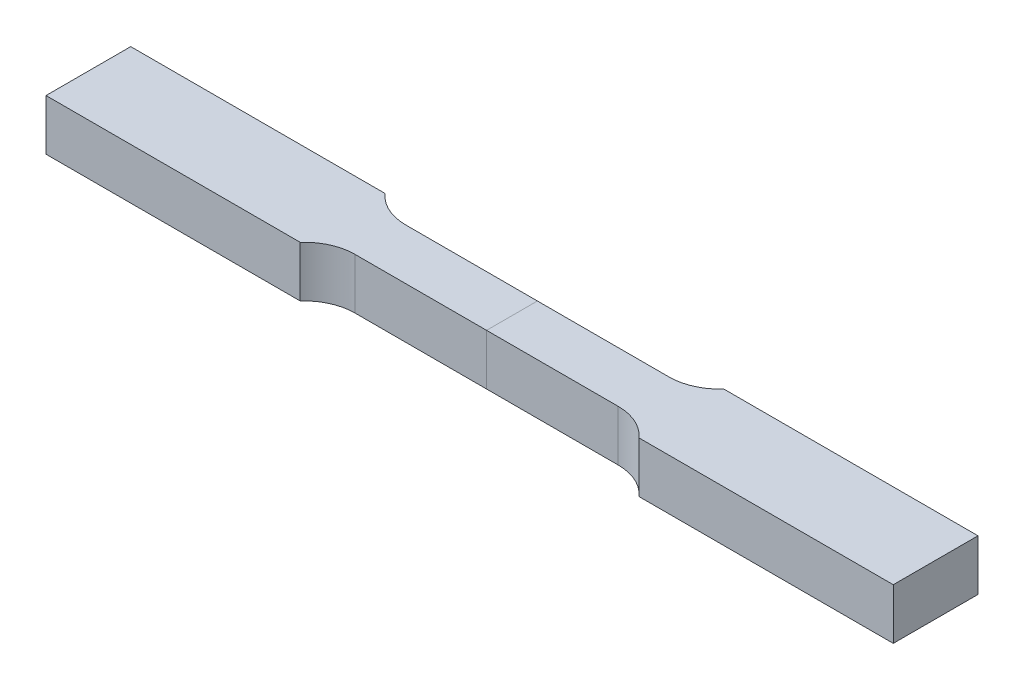
ISO-10303-21;
HEADER;
FILE_DESCRIPTION(('STEP AP214'),'2;1');
FILE_NAME('part.step','',(''),(''),'','','');
FILE_SCHEMA(('AUTOMOTIVE_DESIGN { 1 0 10303 214 1 1 1 1 }'));
ENDSEC;
DATA;
#1=APPLICATION_CONTEXT('core data for automotive mechanical design processes');
#2=APPLICATION_PROTOCOL_DEFINITION('international standard','automotive_design',2000,#1);
#3=PRODUCT_CONTEXT('',#1,'mechanical');
#4=PRODUCT('Part','Part','',(#3));
#5=PRODUCT_RELATED_PRODUCT_CATEGORY('part','',(#4));
#6=PRODUCT_DEFINITION_FORMATION('','',#4);
#7=PRODUCT_DEFINITION_CONTEXT('part definition',#1,'design');
#8=PRODUCT_DEFINITION('design','',#6,#7);
#9=PRODUCT_DEFINITION_SHAPE('','',#8);
#10=(LENGTH_UNIT() NAMED_UNIT(*) SI_UNIT(.MILLI.,.METRE.));
#11=(NAMED_UNIT(*) PLANE_ANGLE_UNIT() SI_UNIT($,.RADIAN.));
#12=(NAMED_UNIT(*) SI_UNIT($,.STERADIAN.) SOLID_ANGLE_UNIT());
#13=UNCERTAINTY_MEASURE_WITH_UNIT(LENGTH_MEASURE(1.E-05),#10,'distance_accuracy_value','');
#14=(GEOMETRIC_REPRESENTATION_CONTEXT(3) GLOBAL_UNCERTAINTY_ASSIGNED_CONTEXT((#13)) GLOBAL_UNIT_ASSIGNED_CONTEXT((#10,
#11,#12)) REPRESENTATION_CONTEXT('',''));
#15=CARTESIAN_POINT('',(0.,0.,0.));
#16=DIRECTION('',(0.,0.,1.));
#17=DIRECTION('',(1.,0.,0.));
#18=AXIS2_PLACEMENT_3D('',#15,#16,#17);
#19=CARTESIAN_POINT('',(0.,6.,-3.));
#20=DIRECTION('',(0.,0.,1.));
#21=DIRECTION('',(-1.,0.,0.));
#22=AXIS2_PLACEMENT_3D('',#19,#20,#21);
#23=PLANE('',#22);
#24=DIRECTION('',(1.,0.,0.));
#25=VECTOR('',#24,1.);
#26=CARTESIAN_POINT('',(0.,0.,-3.));
#27=LINE('',#26,#25);
#28=CARTESIAN_POINT('',(0.,0.,-3.));
#29=VERTEX_POINT('',#28);
#30=CARTESIAN_POINT('',(15.5278640450004,0.,-3.));
#31=VERTEX_POINT('',#30);
#32=EDGE_CURVE('E144',#29,#31,#27,.T.);
#33=ORIENTED_EDGE('',*,*,#32,.F.);
#34=DIRECTION('',(0.,-1.,0.));
#35=VECTOR('',#34,1.);
#36=CARTESIAN_POINT('',(0.,6.,-3.));
#37=LINE('',#36,#35);
#38=CARTESIAN_POINT('',(0.,6.,-3.));
#39=VERTEX_POINT('',#38);
#40=EDGE_CURVE('E143',#39,#29,#37,.T.);
#41=ORIENTED_EDGE('',*,*,#40,.F.);
#42=DIRECTION('',(1.,0.,0.));
#43=VECTOR('',#42,1.);
#44=CARTESIAN_POINT('',(0.,6.,-3.));
#45=LINE('',#44,#43);
#46=CARTESIAN_POINT('',(15.5278640450004,6.,-3.));
#47=VERTEX_POINT('',#46);
#48=EDGE_CURVE('E162',#39,#47,#45,.T.);
#49=ORIENTED_EDGE('',*,*,#48,.T.);
#50=DIRECTION('',(0.,-1.,0.));
#51=VECTOR('',#50,1.);
#52=CARTESIAN_POINT('',(15.5278640450004,6.,-3.));
#53=LINE('',#52,#51);
#54=EDGE_CURVE('E12',#47,#31,#53,.T.);
#55=ORIENTED_EDGE('',*,*,#54,.T.);
#56=EDGE_LOOP('',(#33,#41,#49,#55));
#57=FACE_BOUND('',#56,.T.);
#58=ADVANCED_FACE('F48',(#57),#23,.F.);
#59=CARTESIAN_POINT('',(15.5278640450004,6.,-8.99999999999999));
#60=DIRECTION('',(0.,-1.,0.));
#61=DIRECTION('',(0.,0.,-1.));
#62=AXIS2_PLACEMENT_3D('',#59,#60,#61);
#63=CYLINDRICAL_SURFACE('',#62,6.);
#64=CARTESIAN_POINT('',(15.5278640450004,0.,-8.99999999999999));
#65=DIRECTION('',(0.,1.,0.));
#66=DIRECTION('',(0.,0.,-1.));
#67=AXIS2_PLACEMENT_3D('',#64,#65,#66);
#68=CIRCLE('',#67,6.);
#69=CARTESIAN_POINT('',(20.,0.,-5.));
#70=VERTEX_POINT('',#69);
#71=EDGE_CURVE('E146',#31,#70,#68,.T.);
#72=ORIENTED_EDGE('',*,*,#71,.F.);
#73=ORIENTED_EDGE('',*,*,#54,.F.);
#74=CARTESIAN_POINT('',(15.5278640450004,6.,-8.99999999999999));
#75=DIRECTION('',(0.,1.,0.));
#76=DIRECTION('',(0.,0.,-1.));
#77=AXIS2_PLACEMENT_3D('',#74,#75,#76);
#78=CIRCLE('',#77,6.);
#79=CARTESIAN_POINT('',(20.,6.,-5.));
#80=VERTEX_POINT('',#79);
#81=EDGE_CURVE('E102',#47,#80,#78,.T.);
#82=ORIENTED_EDGE('',*,*,#81,.T.);
#83=DIRECTION('',(0.,-1.,0.));
#84=VECTOR('',#83,1.);
#85=CARTESIAN_POINT('',(20.,6.,-5.));
#86=LINE('',#85,#84);
#87=EDGE_CURVE('E56',#80,#70,#86,.T.);
#88=ORIENTED_EDGE('',*,*,#87,.T.);
#89=EDGE_LOOP('',(#72,#73,#82,#88));
#90=FACE_BOUND('',#89,.T.);
#91=ADVANCED_FACE('F174',(#90),#63,.F.);
#92=CARTESIAN_POINT('',(20.,6.,-5.));
#93=DIRECTION('',(0.,0.,1.));
#94=DIRECTION('',(-1.,0.,0.));
#95=AXIS2_PLACEMENT_3D('',#92,#93,#94);
#96=PLANE('',#95);
#97=DIRECTION('',(1.,0.,0.));
#98=VECTOR('',#97,1.);
#99=CARTESIAN_POINT('',(20.,0.,-5.));
#100=LINE('',#99,#98);
#101=CARTESIAN_POINT('',(50.,0.,-4.99999999999999));
#102=VERTEX_POINT('',#101);
#103=EDGE_CURVE('E149',#70,#102,#100,.T.);
#104=ORIENTED_EDGE('',*,*,#103,.F.);
#105=ORIENTED_EDGE('',*,*,#87,.F.);
#106=DIRECTION('',(1.,0.,0.));
#107=VECTOR('',#106,1.);
#108=CARTESIAN_POINT('',(20.,6.,-5.));
#109=LINE('',#108,#107);
#110=CARTESIAN_POINT('',(50.,6.,-4.99999999999999));
#111=VERTEX_POINT('',#110);
#112=EDGE_CURVE('E183',#80,#111,#109,.T.);
#113=ORIENTED_EDGE('',*,*,#112,.T.);
#114=DIRECTION('',(0.,-1.,0.));
#115=VECTOR('',#114,1.);
#116=CARTESIAN_POINT('',(50.,6.,-4.99999999999999));
#117=LINE('',#116,#115);
#118=EDGE_CURVE('E169',#111,#102,#117,.T.);
#119=ORIENTED_EDGE('',*,*,#118,.T.);
#120=EDGE_LOOP('',(#104,#105,#113,#119));
#121=FACE_BOUND('',#120,.T.);
#122=ADVANCED_FACE('F193',(#121),#96,.F.);
#123=CARTESIAN_POINT('',(50.,6.,-4.99999999999999));
#124=DIRECTION('',(-1.,0.,0.));
#125=DIRECTION('',(0.,0.,-1.));
#126=AXIS2_PLACEMENT_3D('',#123,#124,#125);
#127=PLANE('',#126);
#128=DIRECTION('',(0.,0.,1.));
#129=VECTOR('',#128,1.);
#130=CARTESIAN_POINT('',(50.,0.,-4.99999999999999));
#131=LINE('',#130,#129);
#132=CARTESIAN_POINT('',(50.,0.,5.00000000000001));
#133=VERTEX_POINT('',#132);
#134=EDGE_CURVE('E152',#102,#133,#131,.T.);
#135=ORIENTED_EDGE('',*,*,#134,.F.);
#136=ORIENTED_EDGE('',*,*,#118,.F.);
#137=DIRECTION('',(0.,0.,1.));
#138=VECTOR('',#137,1.);
#139=CARTESIAN_POINT('',(50.,6.,-4.99999999999999));
#140=LINE('',#139,#138);
#141=CARTESIAN_POINT('',(50.,6.,5.00000000000001));
#142=VERTEX_POINT('',#141);
#143=EDGE_CURVE('E138',#111,#142,#140,.T.);
#144=ORIENTED_EDGE('',*,*,#143,.T.);
#145=DIRECTION('',(0.,-1.,0.));
#146=VECTOR('',#145,1.);
#147=CARTESIAN_POINT('',(50.,6.,5.00000000000001));
#148=LINE('',#147,#146);
#149=EDGE_CURVE('E166',#142,#133,#148,.T.);
#150=ORIENTED_EDGE('',*,*,#149,.T.);
#151=EDGE_LOOP('',(#135,#136,#144,#150));
#152=FACE_BOUND('',#151,.T.);
#153=ADVANCED_FACE('F189',(#152),#127,.F.);
#154=CARTESIAN_POINT('',(50.,6.,5.00000000000001));
#155=DIRECTION('',(0.,0.,-1.));
#156=DIRECTION('',(1.,0.,0.));
#157=AXIS2_PLACEMENT_3D('',#154,#155,#156);
#158=PLANE('',#157);
#159=DIRECTION('',(-1.,0.,0.));
#160=VECTOR('',#159,1.);
#161=CARTESIAN_POINT('',(50.,0.,5.00000000000001));
#162=LINE('',#161,#160);
#163=CARTESIAN_POINT('',(20.,0.,5.00000000000001));
#164=VERTEX_POINT('',#163);
#165=EDGE_CURVE('E155',#133,#164,#162,.T.);
#166=ORIENTED_EDGE('',*,*,#165,.F.);
#167=ORIENTED_EDGE('',*,*,#149,.F.);
#168=DIRECTION('',(-1.,0.,0.));
#169=VECTOR('',#168,1.);
#170=CARTESIAN_POINT('',(50.,6.,5.00000000000001));
#171=LINE('',#170,#169);
#172=CARTESIAN_POINT('',(20.,6.,5.00000000000001));
#173=VERTEX_POINT('',#172);
#174=EDGE_CURVE('E136',#142,#173,#171,.T.);
#175=ORIENTED_EDGE('',*,*,#174,.T.);
#176=DIRECTION('',(0.,-1.,0.));
#177=VECTOR('',#176,1.);
#178=CARTESIAN_POINT('',(20.,6.,5.00000000000001));
#179=LINE('',#178,#177);
#180=EDGE_CURVE('E130',#173,#164,#179,.T.);
#181=ORIENTED_EDGE('',*,*,#180,.T.);
#182=EDGE_LOOP('',(#166,#167,#175,#181));
#183=FACE_BOUND('',#182,.T.);
#184=ADVANCED_FACE('F192',(#183),#158,.F.);
#185=CARTESIAN_POINT('',(15.5278640450004,6.,9.));
#186=DIRECTION('',(0.,-1.,0.));
#187=DIRECTION('',(0.,0.,-1.));
#188=AXIS2_PLACEMENT_3D('',#185,#186,#187);
#189=CYLINDRICAL_SURFACE('',#188,6.);
#190=CARTESIAN_POINT('',(15.5278640450004,0.,9.));
#191=DIRECTION('',(0.,1.,0.));
#192=DIRECTION('',(0.,0.,-1.));
#193=AXIS2_PLACEMENT_3D('',#190,#191,#192);
#194=CIRCLE('',#193,6.);
#195=CARTESIAN_POINT('',(15.5278640450004,0.,3.));
#196=VERTEX_POINT('',#195);
#197=EDGE_CURVE('E158',#164,#196,#194,.T.);
#198=ORIENTED_EDGE('',*,*,#197,.F.);
#199=ORIENTED_EDGE('',*,*,#180,.F.);
#200=CARTESIAN_POINT('',(15.5278640450004,6.,9.));
#201=DIRECTION('',(0.,1.,0.));
#202=DIRECTION('',(0.,0.,-1.));
#203=AXIS2_PLACEMENT_3D('',#200,#201,#202);
#204=CIRCLE('',#203,6.);
#205=CARTESIAN_POINT('',(15.5278640450004,6.,3.));
#206=VERTEX_POINT('',#205);
#207=EDGE_CURVE('E120',#173,#206,#204,.T.);
#208=ORIENTED_EDGE('',*,*,#207,.T.);
#209=DIRECTION('',(0.,-1.,0.));
#210=VECTOR('',#209,1.);
#211=CARTESIAN_POINT('',(15.5278640450004,6.,3.));
#212=LINE('',#211,#210);
#213=EDGE_CURVE('E125',#206,#196,#212,.T.);
#214=ORIENTED_EDGE('',*,*,#213,.T.);
#215=EDGE_LOOP('',(#198,#199,#208,#214));
#216=FACE_BOUND('',#215,.T.);
#217=ADVANCED_FACE('F133',(#216),#189,.F.);
#218=CARTESIAN_POINT('',(15.5278640450004,6.,3.));
#219=DIRECTION('',(0.,0.,-1.));
#220=DIRECTION('',(1.,0.,0.));
#221=AXIS2_PLACEMENT_3D('',#218,#219,#220);
#222=PLANE('',#221);
#223=DIRECTION('',(-1.,0.,0.));
#224=VECTOR('',#223,1.);
#225=CARTESIAN_POINT('',(15.5278640450004,0.,3.));
#226=LINE('',#225,#224);
#227=CARTESIAN_POINT('',(0.,0.,3.));
#228=VERTEX_POINT('',#227);
#229=EDGE_CURVE('E127',#196,#228,#226,.T.);
#230=ORIENTED_EDGE('',*,*,#229,.F.);
#231=ORIENTED_EDGE('',*,*,#213,.F.);
#232=DIRECTION('',(-1.,0.,0.));
#233=VECTOR('',#232,1.);
#234=CARTESIAN_POINT('',(15.5278640450004,6.,3.));
#235=LINE('',#234,#233);
#236=CARTESIAN_POINT('',(0.,6.,3.));
#237=VERTEX_POINT('',#236);
#238=EDGE_CURVE('E116',#206,#237,#235,.T.);
#239=ORIENTED_EDGE('',*,*,#238,.T.);
#240=DIRECTION('',(0.,-1.,0.));
#241=VECTOR('',#240,1.);
#242=CARTESIAN_POINT('',(0.,6.,3.));
#243=LINE('',#242,#241);
#244=EDGE_CURVE('E131',#237,#228,#243,.T.);
#245=ORIENTED_EDGE('',*,*,#244,.T.);
#246=EDGE_LOOP('',(#230,#231,#239,#245));
#247=FACE_BOUND('',#246,.T.);
#248=ADVANCED_FACE('F126',(#247),#222,.F.);
#249=CARTESIAN_POINT('',(0.,6.,3.));
#250=DIRECTION('',(1.,0.,0.));
#251=DIRECTION('',(0.,0.,1.));
#252=AXIS2_PLACEMENT_3D('',#249,#250,#251);
#253=PLANE('',#252);
#254=DIRECTION('',(0.,0.,-1.));
#255=VECTOR('',#254,1.);
#256=CARTESIAN_POINT('',(0.,0.,3.));
#257=LINE('',#256,#255);
#258=EDGE_CURVE('E90',#228,#29,#257,.T.);
#259=ORIENTED_EDGE('',*,*,#258,.F.);
#260=ORIENTED_EDGE('',*,*,#244,.F.);
#261=DIRECTION('',(0.,0.,-1.));
#262=VECTOR('',#261,1.);
#263=CARTESIAN_POINT('',(0.,6.,3.));
#264=LINE('',#263,#262);
#265=EDGE_CURVE('E64',#237,#39,#264,.T.);
#266=ORIENTED_EDGE('',*,*,#265,.T.);
#267=ORIENTED_EDGE('',*,*,#40,.T.);
#268=EDGE_LOOP('',(#259,#260,#266,#267));
#269=FACE_BOUND('',#268,.T.);
#270=ADVANCED_FACE('F243',(#269),#253,.F.);
#271=CARTESIAN_POINT('',(15.5278640450004,6.,-8.99999999999999));
#272=DIRECTION('',(0.,-1.,0.));
#273=DIRECTION('',(0.,0.,-1.));
#274=AXIS2_PLACEMENT_3D('',#271,#272,#273);
#275=PLANE('',#274);
#276=ORIENTED_EDGE('',*,*,#48,.F.);
#277=ORIENTED_EDGE('',*,*,#265,.F.);
#278=ORIENTED_EDGE('',*,*,#238,.F.);
#279=ORIENTED_EDGE('',*,*,#207,.F.);
#280=ORIENTED_EDGE('',*,*,#174,.F.);
#281=ORIENTED_EDGE('',*,*,#143,.F.);
#282=ORIENTED_EDGE('',*,*,#112,.F.);
#283=ORIENTED_EDGE('',*,*,#81,.F.);
#284=EDGE_LOOP('',(#276,#277,#278,#279,#280,#281,#282,#283));
#285=FACE_BOUND('',#284,.T.);
#286=ADVANCED_FACE('F118',(#285),#275,.F.);
#287=CARTESIAN_POINT('',(15.5278640450004,0.,-8.99999999999999));
#288=DIRECTION('',(0.,-1.,0.));
#289=DIRECTION('',(0.,0.,-1.));
#290=AXIS2_PLACEMENT_3D('',#287,#288,#289);
#291=PLANE('',#290);
#292=ORIENTED_EDGE('',*,*,#32,.T.);
#293=ORIENTED_EDGE('',*,*,#71,.T.);
#294=ORIENTED_EDGE('',*,*,#103,.T.);
#295=ORIENTED_EDGE('',*,*,#134,.T.);
#296=ORIENTED_EDGE('',*,*,#165,.T.);
#297=ORIENTED_EDGE('',*,*,#197,.T.);
#298=ORIENTED_EDGE('',*,*,#229,.T.);
#299=ORIENTED_EDGE('',*,*,#258,.T.);
#300=EDGE_LOOP('',(#292,#293,#294,#295,#296,#297,#298,#299));
#301=FACE_BOUND('',#300,.T.);
#302=ADVANCED_FACE('F177',(#301),#291,.T.);
#303=CLOSED_SHELL('',(#58,#91,#122,#153,#184,#217,#248,#270,#286,#302));
#304=MANIFOLD_SOLID_BREP('B2',#303);
#305=CARTESIAN_POINT('',(0.,6.,-3.));
#306=DIRECTION('',(0.,0.,1.));
#307=DIRECTION('',(1.,0.,0.));
#308=AXIS2_PLACEMENT_3D('',#305,#306,#307);
#309=PLANE('',#308);
#310=DIRECTION('',(-1.,0.,0.));
#311=VECTOR('',#310,1.);
#312=CARTESIAN_POINT('',(0.,0.,-3.));
#313=LINE('',#312,#311);
#314=CARTESIAN_POINT('',(0.,0.,-3.));
#315=VERTEX_POINT('',#314);
#316=CARTESIAN_POINT('',(-15.5278640450004,0.,-3.));
#317=VERTEX_POINT('',#316);
#318=EDGE_CURVE('E405',#315,#317,#313,.T.);
#319=ORIENTED_EDGE('',*,*,#318,.T.);
#320=DIRECTION('',(0.,-1.,0.));
#321=VECTOR('',#320,1.);
#322=CARTESIAN_POINT('',(-15.5278640450004,6.,-3.));
#323=LINE('',#322,#321);
#324=CARTESIAN_POINT('',(-15.5278640450004,6.,-3.));
#325=VERTEX_POINT('',#324);
#326=EDGE_CURVE('E46',#325,#317,#323,.T.);
#327=ORIENTED_EDGE('',*,*,#326,.F.);
#328=DIRECTION('',(-1.,0.,0.));
#329=VECTOR('',#328,1.);
#330=CARTESIAN_POINT('',(0.,6.,-3.));
#331=LINE('',#330,#329);
#332=CARTESIAN_POINT('',(0.,6.,-3.));
#333=VERTEX_POINT('',#332);
#334=EDGE_CURVE('E419',#333,#325,#331,.T.);
#335=ORIENTED_EDGE('',*,*,#334,.F.);
#336=DIRECTION('',(0.,-1.,0.));
#337=VECTOR('',#336,1.);
#338=CARTESIAN_POINT('',(0.,6.,-3.));
#339=LINE('',#338,#337);
#340=EDGE_CURVE('E401',#333,#315,#339,.T.);
#341=ORIENTED_EDGE('',*,*,#340,.T.);
#342=EDGE_LOOP('',(#319,#327,#335,#341));
#343=FACE_BOUND('',#342,.T.);
#344=ADVANCED_FACE('F309',(#343),#309,.F.);
#345=CARTESIAN_POINT('',(-15.5278640450004,6.,-8.99999999999999));
#346=DIRECTION('',(0.,-1.,0.));
#347=DIRECTION('',(0.,0.,-1.));
#348=AXIS2_PLACEMENT_3D('',#345,#346,#347);
#349=CYLINDRICAL_SURFACE('',#348,6.);
#350=CARTESIAN_POINT('',(-15.5278640450004,0.,-8.99999999999999));
#351=DIRECTION('',(0.,-1.,0.));
#352=DIRECTION('',(0.,0.,-1.));
#353=AXIS2_PLACEMENT_3D('',#350,#351,#352);
#354=CIRCLE('',#353,6.);
#355=CARTESIAN_POINT('',(-20.,0.,-5.));
#356=VERTEX_POINT('',#355);
#357=EDGE_CURVE('E408',#317,#356,#354,.T.);
#358=ORIENTED_EDGE('',*,*,#357,.T.);
#359=DIRECTION('',(0.,-1.,0.));
#360=VECTOR('',#359,1.);
#361=CARTESIAN_POINT('',(-20.,6.,-5.));
#362=LINE('',#361,#360);
#363=CARTESIAN_POINT('',(-20.,6.,-5.));
#364=VERTEX_POINT('',#363);
#365=EDGE_CURVE('E317',#364,#356,#362,.T.);
#366=ORIENTED_EDGE('',*,*,#365,.F.);
#367=CARTESIAN_POINT('',(-15.5278640450004,6.,-8.99999999999999));
#368=DIRECTION('',(0.,-1.,0.));
#369=DIRECTION('',(0.,0.,-1.));
#370=AXIS2_PLACEMENT_3D('',#367,#368,#369);
#371=CIRCLE('',#370,6.);
#372=EDGE_CURVE('E368',#325,#364,#371,.T.);
#373=ORIENTED_EDGE('',*,*,#372,.F.);
#374=ORIENTED_EDGE('',*,*,#326,.T.);
#375=EDGE_LOOP('',(#358,#366,#373,#374));
#376=FACE_BOUND('',#375,.T.);
#377=ADVANCED_FACE('F454',(#376),#349,.F.);
#378=CARTESIAN_POINT('',(-20.,6.,-5.));
#379=DIRECTION('',(0.,0.,1.));
#380=DIRECTION('',(1.,0.,0.));
#381=AXIS2_PLACEMENT_3D('',#378,#379,#380);
#382=PLANE('',#381);
#383=DIRECTION('',(-1.,0.,0.));
#384=VECTOR('',#383,1.);
#385=CARTESIAN_POINT('',(-20.,0.,-5.));
#386=LINE('',#385,#384);
#387=CARTESIAN_POINT('',(-50.,0.,-4.99999999999999));
#388=VERTEX_POINT('',#387);
#389=EDGE_CURVE('E410',#356,#388,#386,.T.);
#390=ORIENTED_EDGE('',*,*,#389,.T.);
#391=DIRECTION('',(0.,-1.,0.));
#392=VECTOR('',#391,1.);
#393=CARTESIAN_POINT('',(-50.,6.,-4.99999999999999));
#394=LINE('',#393,#392);
#395=CARTESIAN_POINT('',(-50.,6.,-4.99999999999999));
#396=VERTEX_POINT('',#395);
#397=EDGE_CURVE('E426',#396,#388,#394,.T.);
#398=ORIENTED_EDGE('',*,*,#397,.F.);
#399=DIRECTION('',(-1.,0.,0.));
#400=VECTOR('',#399,1.);
#401=CARTESIAN_POINT('',(-20.,6.,-5.));
#402=LINE('',#401,#400);
#403=EDGE_CURVE('E434',#364,#396,#402,.T.);
#404=ORIENTED_EDGE('',*,*,#403,.F.);
#405=ORIENTED_EDGE('',*,*,#365,.T.);
#406=EDGE_LOOP('',(#390,#398,#404,#405));
#407=FACE_BOUND('',#406,.T.);
#408=ADVANCED_FACE('F432',(#407),#382,.F.);
#409=CARTESIAN_POINT('',(-50.,6.,-4.99999999999999));
#410=DIRECTION('',(1.,0.,0.));
#411=DIRECTION('',(0.,0.,-1.));
#412=AXIS2_PLACEMENT_3D('',#409,#410,#411);
#413=PLANE('',#412);
#414=DIRECTION('',(0.,0.,1.));
#415=VECTOR('',#414,1.);
#416=CARTESIAN_POINT('',(-50.,0.,-4.99999999999999));
#417=LINE('',#416,#415);
#418=CARTESIAN_POINT('',(-50.,0.,5.00000000000001));
#419=VERTEX_POINT('',#418);
#420=EDGE_CURVE('E412',#388,#419,#417,.T.);
#421=ORIENTED_EDGE('',*,*,#420,.T.);
#422=DIRECTION('',(0.,-1.,0.));
#423=VECTOR('',#422,1.);
#424=CARTESIAN_POINT('',(-50.,6.,5.00000000000001));
#425=LINE('',#424,#423);
#426=CARTESIAN_POINT('',(-50.,6.,5.00000000000001));
#427=VERTEX_POINT('',#426);
#428=EDGE_CURVE('E423',#427,#419,#425,.T.);
#429=ORIENTED_EDGE('',*,*,#428,.F.);
#430=DIRECTION('',(0.,0.,1.));
#431=VECTOR('',#430,1.);
#432=CARTESIAN_POINT('',(-50.,6.,-4.99999999999999));
#433=LINE('',#432,#431);
#434=EDGE_CURVE('E446',#396,#427,#433,.T.);
#435=ORIENTED_EDGE('',*,*,#434,.F.);
#436=ORIENTED_EDGE('',*,*,#397,.T.);
#437=EDGE_LOOP('',(#421,#429,#435,#436));
#438=FACE_BOUND('',#437,.T.);
#439=ADVANCED_FACE('F442',(#438),#413,.F.);
#440=CARTESIAN_POINT('',(-50.,6.,5.00000000000001));
#441=DIRECTION('',(0.,0.,-1.));
#442=DIRECTION('',(-1.,0.,0.));
#443=AXIS2_PLACEMENT_3D('',#440,#441,#442);
#444=PLANE('',#443);
#445=DIRECTION('',(1.,0.,0.));
#446=VECTOR('',#445,1.);
#447=CARTESIAN_POINT('',(-50.,0.,5.00000000000001));
#448=LINE('',#447,#446);
#449=CARTESIAN_POINT('',(-20.,0.,5.00000000000001));
#450=VERTEX_POINT('',#449);
#451=EDGE_CURVE('E414',#419,#450,#448,.T.);
#452=ORIENTED_EDGE('',*,*,#451,.T.);
#453=DIRECTION('',(0.,-1.,0.));
#454=VECTOR('',#453,1.);
#455=CARTESIAN_POINT('',(-20.,6.,5.00000000000001));
#456=LINE('',#455,#454);
#457=CARTESIAN_POINT('',(-20.,6.,5.00000000000001));
#458=VERTEX_POINT('',#457);
#459=EDGE_CURVE('E396',#458,#450,#456,.T.);
#460=ORIENTED_EDGE('',*,*,#459,.F.);
#461=DIRECTION('',(1.,0.,0.));
#462=VECTOR('',#461,1.);
#463=CARTESIAN_POINT('',(-50.,6.,5.00000000000001));
#464=LINE('',#463,#462);
#465=EDGE_CURVE('E387',#427,#458,#464,.T.);
#466=ORIENTED_EDGE('',*,*,#465,.F.);
#467=ORIENTED_EDGE('',*,*,#428,.T.);
#468=EDGE_LOOP('',(#452,#460,#466,#467));
#469=FACE_BOUND('',#468,.T.);
#470=ADVANCED_FACE('F445',(#469),#444,.F.);
#471=CARTESIAN_POINT('',(-15.5278640450004,6.,9.));
#472=DIRECTION('',(0.,-1.,0.));
#473=DIRECTION('',(0.,0.,-1.));
#474=AXIS2_PLACEMENT_3D('',#471,#472,#473);
#475=CYLINDRICAL_SURFACE('',#474,6.);
#476=CARTESIAN_POINT('',(-15.5278640450004,0.,9.));
#477=DIRECTION('',(0.,-1.,0.));
#478=DIRECTION('',(0.,0.,-1.));
#479=AXIS2_PLACEMENT_3D('',#476,#477,#478);
#480=CIRCLE('',#479,6.);
#481=CARTESIAN_POINT('',(-15.5278640450004,0.,3.));
#482=VERTEX_POINT('',#481);
#483=EDGE_CURVE('E395',#450,#482,#480,.T.);
#484=ORIENTED_EDGE('',*,*,#483,.T.);
#485=DIRECTION('',(0.,-1.,0.));
#486=VECTOR('',#485,1.);
#487=CARTESIAN_POINT('',(-15.5278640450004,6.,3.));
#488=LINE('',#487,#486);
#489=CARTESIAN_POINT('',(-15.5278640450004,6.,3.));
#490=VERTEX_POINT('',#489);
#491=EDGE_CURVE('E392',#490,#482,#488,.T.);
#492=ORIENTED_EDGE('',*,*,#491,.F.);
#493=CARTESIAN_POINT('',(-15.5278640450004,6.,9.));
#494=DIRECTION('',(0.,-1.,0.));
#495=DIRECTION('',(0.,0.,-1.));
#496=AXIS2_PLACEMENT_3D('',#493,#494,#495);
#497=CIRCLE('',#496,6.);
#498=EDGE_CURVE('E381',#458,#490,#497,.T.);
#499=ORIENTED_EDGE('',*,*,#498,.F.);
#500=ORIENTED_EDGE('',*,*,#459,.T.);
#501=EDGE_LOOP('',(#484,#492,#499,#500));
#502=FACE_BOUND('',#501,.T.);
#503=ADVANCED_FACE('F393',(#502),#475,.F.);
#504=CARTESIAN_POINT('',(-15.5278640450004,6.,3.));
#505=DIRECTION('',(0.,0.,-1.));
#506=DIRECTION('',(-1.,0.,0.));
#507=AXIS2_PLACEMENT_3D('',#504,#505,#506);
#508=PLANE('',#507);
#509=DIRECTION('',(1.,0.,0.));
#510=VECTOR('',#509,1.);
#511=CARTESIAN_POINT('',(-15.5278640450004,0.,3.));
#512=LINE('',#511,#510);
#513=CARTESIAN_POINT('',(0.,0.,3.));
#514=VERTEX_POINT('',#513);
#515=EDGE_CURVE('E354',#482,#514,#512,.T.);
#516=ORIENTED_EDGE('',*,*,#515,.T.);
#517=DIRECTION('',(0.,-1.,0.));
#518=VECTOR('',#517,1.);
#519=CARTESIAN_POINT('',(0.,6.,3.));
#520=LINE('',#519,#518);
#521=CARTESIAN_POINT('',(0.,6.,3.));
#522=VERTEX_POINT('',#521);
#523=EDGE_CURVE('E397',#522,#514,#520,.T.);
#524=ORIENTED_EDGE('',*,*,#523,.F.);
#525=DIRECTION('',(1.,0.,0.));
#526=VECTOR('',#525,1.);
#527=CARTESIAN_POINT('',(-15.5278640450004,6.,3.));
#528=LINE('',#527,#526);
#529=EDGE_CURVE('E385',#490,#522,#528,.T.);
#530=ORIENTED_EDGE('',*,*,#529,.F.);
#531=ORIENTED_EDGE('',*,*,#491,.T.);
#532=EDGE_LOOP('',(#516,#524,#530,#531));
#533=FACE_BOUND('',#532,.T.);
#534=ADVANCED_FACE('F399',(#533),#508,.F.);
#535=CARTESIAN_POINT('',(0.,6.,3.));
#536=DIRECTION('',(-1.,0.,0.));
#537=DIRECTION('',(0.,0.,1.));
#538=AXIS2_PLACEMENT_3D('',#535,#536,#537);
#539=PLANE('',#538);
#540=DIRECTION('',(0.,0.,-1.));
#541=VECTOR('',#540,1.);
#542=CARTESIAN_POINT('',(0.,0.,3.));
#543=LINE('',#542,#541);
#544=EDGE_CURVE('E360',#514,#315,#543,.T.);
#545=ORIENTED_EDGE('',*,*,#544,.T.);
#546=ORIENTED_EDGE('',*,*,#340,.F.);
#547=DIRECTION('',(0.,0.,-1.));
#548=VECTOR('',#547,1.);
#549=CARTESIAN_POINT('',(0.,6.,3.));
#550=LINE('',#549,#548);
#551=EDGE_CURVE('E325',#522,#333,#550,.T.);
#552=ORIENTED_EDGE('',*,*,#551,.F.);
#553=ORIENTED_EDGE('',*,*,#523,.T.);
#554=EDGE_LOOP('',(#545,#546,#552,#553));
#555=FACE_BOUND('',#554,.T.);
#556=ADVANCED_FACE('F470',(#555),#539,.F.);
#557=CARTESIAN_POINT('',(-15.5278640450004,6.,-8.99999999999999));
#558=DIRECTION('',(0.,-1.,0.));
#559=DIRECTION('',(0.,0.,-1.));
#560=AXIS2_PLACEMENT_3D('',#557,#558,#559);
#561=PLANE('',#560);
#562=ORIENTED_EDGE('',*,*,#334,.T.);
#563=ORIENTED_EDGE('',*,*,#372,.T.);
#564=ORIENTED_EDGE('',*,*,#403,.T.);
#565=ORIENTED_EDGE('',*,*,#434,.T.);
#566=ORIENTED_EDGE('',*,*,#465,.T.);
#567=ORIENTED_EDGE('',*,*,#498,.T.);
#568=ORIENTED_EDGE('',*,*,#529,.T.);
#569=ORIENTED_EDGE('',*,*,#551,.T.);
#570=EDGE_LOOP('',(#562,#563,#564,#565,#566,#567,#568,#569));
#571=FACE_BOUND('',#570,.T.);
#572=ADVANCED_FACE('F383',(#571),#561,.F.);
#573=CARTESIAN_POINT('',(-15.5278640450004,0.,-8.99999999999999));
#574=DIRECTION('',(0.,-1.,0.));
#575=DIRECTION('',(0.,0.,-1.));
#576=AXIS2_PLACEMENT_3D('',#573,#574,#575);
#577=PLANE('',#576);
#578=ORIENTED_EDGE('',*,*,#318,.F.);
#579=ORIENTED_EDGE('',*,*,#544,.F.);
#580=ORIENTED_EDGE('',*,*,#515,.F.);
#581=ORIENTED_EDGE('',*,*,#483,.F.);
#582=ORIENTED_EDGE('',*,*,#451,.F.);
#583=ORIENTED_EDGE('',*,*,#420,.F.);
#584=ORIENTED_EDGE('',*,*,#389,.F.);
#585=ORIENTED_EDGE('',*,*,#357,.F.);
#586=EDGE_LOOP('',(#578,#579,#580,#581,#582,#583,#584,#585));
#587=FACE_BOUND('',#586,.T.);
#588=ADVANCED_FACE('F438',(#587),#577,.T.);
#589=CLOSED_SHELL('',(#344,#377,#408,#439,#470,#503,#534,#556,#572,#588));
#590=MANIFOLD_SOLID_BREP('B6',#589);
#591=ADVANCED_BREP_SHAPE_REPRESENTATION('',(#18,#304,#590),#14);
#592=SHAPE_DEFINITION_REPRESENTATION(#9,#591);
ENDSEC;
END-ISO-10303-21;
